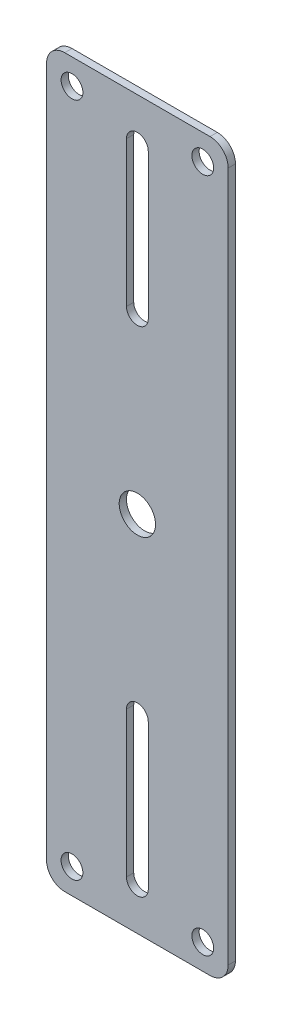
ISO-10303-21;
HEADER;
FILE_DESCRIPTION(('STEP AP214'),'2;1');
FILE_NAME('part.step','',(''),(''),'','','');
FILE_SCHEMA(('AUTOMOTIVE_DESIGN { 1 0 10303 214 1 1 1 1 }'));
ENDSEC;
DATA;
#1=APPLICATION_CONTEXT('core data for automotive mechanical design processes');
#2=APPLICATION_PROTOCOL_DEFINITION('international standard','automotive_design',2000,#1);
#3=PRODUCT_CONTEXT('',#1,'mechanical');
#4=PRODUCT('Part','Part','',(#3));
#5=PRODUCT_RELATED_PRODUCT_CATEGORY('part','',(#4));
#6=PRODUCT_DEFINITION_FORMATION('','',#4);
#7=PRODUCT_DEFINITION_CONTEXT('part definition',#1,'design');
#8=PRODUCT_DEFINITION('design','',#6,#7);
#9=PRODUCT_DEFINITION_SHAPE('','',#8);
#10=(LENGTH_UNIT() NAMED_UNIT(*) SI_UNIT(.MILLI.,.METRE.));
#11=(NAMED_UNIT(*) PLANE_ANGLE_UNIT() SI_UNIT($,.RADIAN.));
#12=(NAMED_UNIT(*) SI_UNIT($,.STERADIAN.) SOLID_ANGLE_UNIT());
#13=UNCERTAINTY_MEASURE_WITH_UNIT(LENGTH_MEASURE(1.E-05),#10,'distance_accuracy_value','');
#14=(GEOMETRIC_REPRESENTATION_CONTEXT(3) GLOBAL_UNCERTAINTY_ASSIGNED_CONTEXT((#13)) GLOBAL_UNIT_ASSIGNED_CONTEXT((#10,
#11,#12)) REPRESENTATION_CONTEXT('',''));
#15=CARTESIAN_POINT('',(0.,0.,0.));
#16=DIRECTION('',(0.,0.,1.));
#17=DIRECTION('',(1.,0.,0.));
#18=AXIS2_PLACEMENT_3D('',#15,#16,#17);
#19=CARTESIAN_POINT('',(0.,0.,2.));
#20=DIRECTION('',(0.,0.,1.));
#21=DIRECTION('',(1.,0.,0.));
#22=AXIS2_PLACEMENT_3D('',#19,#20,#21);
#23=PLANE('',#22);
#24=CARTESIAN_POINT('',(0.,0.,2.));
#25=DIRECTION('',(0.,0.,1.));
#26=DIRECTION('',(1.,0.,0.));
#27=AXIS2_PLACEMENT_3D('',#24,#25,#26);
#28=CIRCLE('',#27,5.);
#29=CARTESIAN_POINT('',(5.,0.,2.));
#30=VERTEX_POINT('',#29);
#31=EDGE_CURVE('E382',#30,#30,#28,.T.);
#32=ORIENTED_EDGE('',*,*,#31,.F.);
#33=EDGE_LOOP('',(#32));
#34=FACE_BOUND('',#33,.T.);
#35=CARTESIAN_POINT('',(-18.,93.,2.));
#36=DIRECTION('',(0.,0.,1.));
#37=DIRECTION('',(1.,0.,0.));
#38=AXIS2_PLACEMENT_3D('',#35,#36,#37);
#39=CIRCLE('',#38,3.);
#40=CARTESIAN_POINT('',(-15.,93.,2.));
#41=VERTEX_POINT('',#40);
#42=EDGE_CURVE('E227',#41,#41,#39,.T.);
#43=ORIENTED_EDGE('',*,*,#42,.F.);
#44=EDGE_LOOP('',(#43));
#45=FACE_BOUND('',#44,.T.);
#46=DIRECTION('',(-1.,0.,0.));
#47=VECTOR('',#46,1.);
#48=CARTESIAN_POINT('',(-25.,100.,2.));
#49=LINE('',#48,#47);
#50=CARTESIAN_POINT('',(20.,100.,2.));
#51=VERTEX_POINT('',#50);
#52=CARTESIAN_POINT('',(-20.,100.,2.));
#53=VERTEX_POINT('',#52);
#54=EDGE_CURVE('E267',#51,#53,#49,.T.);
#55=ORIENTED_EDGE('',*,*,#54,.T.);
#56=CARTESIAN_POINT('',(-20.,95.,2.));
#57=DIRECTION('',(0.,0.,1.));
#58=DIRECTION('',(1.,0.,0.));
#59=AXIS2_PLACEMENT_3D('',#56,#57,#58);
#60=CIRCLE('',#59,5.);
#61=CARTESIAN_POINT('',(-25.,95.,2.));
#62=VERTEX_POINT('',#61);
#63=EDGE_CURVE('E11',#53,#62,#60,.T.);
#64=ORIENTED_EDGE('',*,*,#63,.T.);
#65=DIRECTION('',(0.,-1.,0.));
#66=VECTOR('',#65,1.);
#67=CARTESIAN_POINT('',(-25.,100.,2.));
#68=LINE('',#67,#66);
#69=CARTESIAN_POINT('',(-25.,-95.,2.));
#70=VERTEX_POINT('',#69);
#71=EDGE_CURVE('E270',#62,#70,#68,.T.);
#72=ORIENTED_EDGE('',*,*,#71,.T.);
#73=CARTESIAN_POINT('',(-20.,-95.,2.));
#74=DIRECTION('',(0.,0.,-1.));
#75=DIRECTION('',(1.,0.,0.));
#76=AXIS2_PLACEMENT_3D('',#73,#74,#75);
#77=CIRCLE('',#76,5.);
#78=CARTESIAN_POINT('',(-20.,-100.,2.));
#79=VERTEX_POINT('',#78);
#80=EDGE_CURVE('E217',#79,#70,#77,.T.);
#81=ORIENTED_EDGE('',*,*,#80,.F.);
#82=DIRECTION('',(-1.,0.,0.));
#83=VECTOR('',#82,1.);
#84=CARTESIAN_POINT('',(-25.,-100.,2.));
#85=LINE('',#84,#83);
#86=CARTESIAN_POINT('',(20.,-100.,2.));
#87=VERTEX_POINT('',#86);
#88=EDGE_CURVE('E193',#87,#79,#85,.T.);
#89=ORIENTED_EDGE('',*,*,#88,.F.);
#90=CARTESIAN_POINT('',(20.,-95.,2.));
#91=DIRECTION('',(0.,0.,-1.));
#92=DIRECTION('',(1.,0.,0.));
#93=AXIS2_PLACEMENT_3D('',#90,#91,#92);
#94=CIRCLE('',#93,5.);
#95=CARTESIAN_POINT('',(25.,-95.,2.));
#96=VERTEX_POINT('',#95);
#97=EDGE_CURVE('E206',#96,#87,#94,.T.);
#98=ORIENTED_EDGE('',*,*,#97,.F.);
#99=DIRECTION('',(0.,1.,0.));
#100=VECTOR('',#99,1.);
#101=CARTESIAN_POINT('',(25.,100.,2.));
#102=LINE('',#101,#100);
#103=CARTESIAN_POINT('',(25.,95.,2.));
#104=VERTEX_POINT('',#103);
#105=EDGE_CURVE('E264',#96,#104,#102,.T.);
#106=ORIENTED_EDGE('',*,*,#105,.T.);
#107=CARTESIAN_POINT('',(20.,95.,2.));
#108=DIRECTION('',(0.,0.,1.));
#109=DIRECTION('',(1.,0.,0.));
#110=AXIS2_PLACEMENT_3D('',#107,#108,#109);
#111=CIRCLE('',#110,5.);
#112=EDGE_CURVE('E284',#104,#51,#111,.T.);
#113=ORIENTED_EDGE('',*,*,#112,.T.);
#114=EDGE_LOOP('',(#55,#64,#72,#81,#89,#98,#106,#113));
#115=FACE_BOUND('',#114,.T.);
#116=DIRECTION('',(0.,-1.,0.));
#117=VECTOR('',#116,1.);
#118=CARTESIAN_POINT('',(-2.99999999999999,88.,2.));
#119=LINE('',#118,#117);
#120=CARTESIAN_POINT('',(-2.99999999999999,88.,2.));
#121=VERTEX_POINT('',#120);
#122=CARTESIAN_POINT('',(-3.,48.,2.));
#123=VERTEX_POINT('',#122);
#124=EDGE_CURVE('E235',#121,#123,#119,.T.);
#125=ORIENTED_EDGE('',*,*,#124,.F.);
#126=CARTESIAN_POINT('',(0.,88.,2.));
#127=DIRECTION('',(0.,0.,1.));
#128=DIRECTION('',(1.,0.,0.));
#129=AXIS2_PLACEMENT_3D('',#126,#127,#128);
#130=CIRCLE('',#129,3.);
#131=CARTESIAN_POINT('',(3.,88.,2.));
#132=VERTEX_POINT('',#131);
#133=EDGE_CURVE('E233',#132,#121,#130,.T.);
#134=ORIENTED_EDGE('',*,*,#133,.F.);
#135=DIRECTION('',(0.,1.,0.));
#136=VECTOR('',#135,1.);
#137=CARTESIAN_POINT('',(3.,48.,2.));
#138=LINE('',#137,#136);
#139=CARTESIAN_POINT('',(3.,48.,2.));
#140=VERTEX_POINT('',#139);
#141=EDGE_CURVE('E241',#140,#132,#138,.T.);
#142=ORIENTED_EDGE('',*,*,#141,.F.);
#143=CARTESIAN_POINT('',(0.,48.,2.));
#144=DIRECTION('',(0.,0.,1.));
#145=DIRECTION('',(1.,0.,0.));
#146=AXIS2_PLACEMENT_3D('',#143,#144,#145);
#147=CIRCLE('',#146,3.);
#148=EDGE_CURVE('E238',#123,#140,#147,.T.);
#149=ORIENTED_EDGE('',*,*,#148,.F.);
#150=EDGE_LOOP('',(#125,#134,#142,#149));
#151=FACE_BOUND('',#150,.T.);
#152=CARTESIAN_POINT('',(18.,93.,2.));
#153=DIRECTION('',(0.,0.,1.));
#154=DIRECTION('',(1.,0.,0.));
#155=AXIS2_PLACEMENT_3D('',#152,#153,#154);
#156=CIRCLE('',#155,3.);
#157=CARTESIAN_POINT('',(21.,93.,2.));
#158=VERTEX_POINT('',#157);
#159=EDGE_CURVE('E221',#158,#158,#156,.T.);
#160=ORIENTED_EDGE('',*,*,#159,.F.);
#161=EDGE_LOOP('',(#160));
#162=FACE_BOUND('',#161,.T.);
#163=CARTESIAN_POINT('',(-18.,-93.,2.));
#164=DIRECTION('',(0.,0.,-1.));
#165=DIRECTION('',(1.,0.,0.));
#166=AXIS2_PLACEMENT_3D('',#163,#164,#165);
#167=CIRCLE('',#166,3.);
#168=CARTESIAN_POINT('',(-15.,-93.,2.));
#169=VERTEX_POINT('',#168);
#170=EDGE_CURVE('E182',#169,#169,#167,.T.);
#171=ORIENTED_EDGE('',*,*,#170,.T.);
#172=EDGE_LOOP('',(#171));
#173=FACE_BOUND('',#172,.T.);
#174=DIRECTION('',(0.,1.,0.));
#175=VECTOR('',#174,1.);
#176=CARTESIAN_POINT('',(-2.99999999999999,-88.,2.));
#177=LINE('',#176,#175);
#178=CARTESIAN_POINT('',(-2.99999999999999,-88.,2.));
#179=VERTEX_POINT('',#178);
#180=CARTESIAN_POINT('',(-3.,-48.,2.));
#181=VERTEX_POINT('',#180);
#182=EDGE_CURVE('E166',#179,#181,#177,.T.);
#183=ORIENTED_EDGE('',*,*,#182,.T.);
#184=CARTESIAN_POINT('',(0.,-48.,2.));
#185=DIRECTION('',(0.,0.,-1.));
#186=DIRECTION('',(1.,0.,0.));
#187=AXIS2_PLACEMENT_3D('',#184,#185,#186);
#188=CIRCLE('',#187,3.);
#189=CARTESIAN_POINT('',(3.,-48.,2.));
#190=VERTEX_POINT('',#189);
#191=EDGE_CURVE('E173',#181,#190,#188,.T.);
#192=ORIENTED_EDGE('',*,*,#191,.T.);
#193=DIRECTION('',(0.,-1.,0.));
#194=VECTOR('',#193,1.);
#195=CARTESIAN_POINT('',(3.,-48.,2.));
#196=LINE('',#195,#194);
#197=CARTESIAN_POINT('',(3.,-88.,2.));
#198=VERTEX_POINT('',#197);
#199=EDGE_CURVE('E168',#190,#198,#196,.T.);
#200=ORIENTED_EDGE('',*,*,#199,.T.);
#201=CARTESIAN_POINT('',(0.,-88.,2.));
#202=DIRECTION('',(0.,0.,-1.));
#203=DIRECTION('',(1.,0.,0.));
#204=AXIS2_PLACEMENT_3D('',#201,#202,#203);
#205=CIRCLE('',#204,3.);
#206=EDGE_CURVE('E151',#198,#179,#205,.T.);
#207=ORIENTED_EDGE('',*,*,#206,.T.);
#208=EDGE_LOOP('',(#183,#192,#200,#207));
#209=FACE_BOUND('',#208,.T.);
#210=CARTESIAN_POINT('',(18.,-93.,2.));
#211=DIRECTION('',(0.,0.,-1.));
#212=DIRECTION('',(1.,0.,0.));
#213=AXIS2_PLACEMENT_3D('',#210,#211,#212);
#214=CIRCLE('',#213,3.);
#215=CARTESIAN_POINT('',(21.,-93.,2.));
#216=VERTEX_POINT('',#215);
#217=EDGE_CURVE('E374',#216,#216,#214,.T.);
#218=ORIENTED_EDGE('',*,*,#217,.T.);
#219=EDGE_LOOP('',(#218));
#220=FACE_BOUND('',#219,.T.);
#221=ADVANCED_FACE('F35',(#34,#45,#115,#151,#162,#173,#209,#220),#23,.T.);
#222=CARTESIAN_POINT('',(0.,0.,0.));
#223=DIRECTION('',(0.,0.,1.));
#224=DIRECTION('',(1.,0.,0.));
#225=AXIS2_PLACEMENT_3D('',#222,#223,#224);
#226=PLANE('',#225);
#227=CARTESIAN_POINT('',(0.,0.,0.));
#228=DIRECTION('',(0.,0.,1.));
#229=DIRECTION('',(1.,0.,0.));
#230=AXIS2_PLACEMENT_3D('',#227,#228,#229);
#231=CIRCLE('',#230,5.);
#232=CARTESIAN_POINT('',(5.,0.,0.));
#233=VERTEX_POINT('',#232);
#234=EDGE_CURVE('E379',#233,#233,#231,.T.);
#235=ORIENTED_EDGE('',*,*,#234,.T.);
#236=EDGE_LOOP('',(#235));
#237=FACE_BOUND('',#236,.T.);
#238=CARTESIAN_POINT('',(-18.,93.,0.));
#239=DIRECTION('',(0.,0.,1.));
#240=DIRECTION('',(1.,0.,0.));
#241=AXIS2_PLACEMENT_3D('',#238,#239,#240);
#242=CIRCLE('',#241,3.);
#243=CARTESIAN_POINT('',(-15.,93.,0.));
#244=VERTEX_POINT('',#243);
#245=EDGE_CURVE('E224',#244,#244,#242,.T.);
#246=ORIENTED_EDGE('',*,*,#245,.T.);
#247=EDGE_LOOP('',(#246));
#248=FACE_BOUND('',#247,.T.);
#249=DIRECTION('',(0.,-1.,0.));
#250=VECTOR('',#249,1.);
#251=CARTESIAN_POINT('',(-25.,100.,0.));
#252=LINE('',#251,#250);
#253=CARTESIAN_POINT('',(-25.,95.,0.));
#254=VERTEX_POINT('',#253);
#255=CARTESIAN_POINT('',(-25.,-95.,0.));
#256=VERTEX_POINT('',#255);
#257=EDGE_CURVE('E268',#254,#256,#252,.T.);
#258=ORIENTED_EDGE('',*,*,#257,.F.);
#259=CARTESIAN_POINT('',(-20.,95.,0.));
#260=DIRECTION('',(0.,0.,1.));
#261=DIRECTION('',(1.,0.,0.));
#262=AXIS2_PLACEMENT_3D('',#259,#260,#261);
#263=CIRCLE('',#262,5.);
#264=CARTESIAN_POINT('',(-20.,100.,0.));
#265=VERTEX_POINT('',#264);
#266=EDGE_CURVE('E57',#254,#265,#263,.F.);
#267=ORIENTED_EDGE('',*,*,#266,.T.);
#268=DIRECTION('',(-1.,0.,0.));
#269=VECTOR('',#268,1.);
#270=CARTESIAN_POINT('',(-25.,100.,0.));
#271=LINE('',#270,#269);
#272=CARTESIAN_POINT('',(20.,100.,0.));
#273=VERTEX_POINT('',#272);
#274=EDGE_CURVE('E275',#273,#265,#271,.T.);
#275=ORIENTED_EDGE('',*,*,#274,.F.);
#276=CARTESIAN_POINT('',(20.,95.,0.));
#277=DIRECTION('',(0.,0.,1.));
#278=DIRECTION('',(1.,0.,0.));
#279=AXIS2_PLACEMENT_3D('',#276,#277,#278);
#280=CIRCLE('',#279,5.);
#281=CARTESIAN_POINT('',(25.,95.,0.));
#282=VERTEX_POINT('',#281);
#283=EDGE_CURVE('E280',#273,#282,#280,.F.);
#284=ORIENTED_EDGE('',*,*,#283,.T.);
#285=DIRECTION('',(0.,1.,0.));
#286=VECTOR('',#285,1.);
#287=CARTESIAN_POINT('',(25.,100.,0.));
#288=LINE('',#287,#286);
#289=CARTESIAN_POINT('',(25.,-95.,0.));
#290=VERTEX_POINT('',#289);
#291=EDGE_CURVE('E263',#290,#282,#288,.T.);
#292=ORIENTED_EDGE('',*,*,#291,.F.);
#293=CARTESIAN_POINT('',(20.,-95.,0.));
#294=DIRECTION('',(0.,0.,-1.));
#295=DIRECTION('',(1.,0.,0.));
#296=AXIS2_PLACEMENT_3D('',#293,#294,#295);
#297=CIRCLE('',#296,5.);
#298=CARTESIAN_POINT('',(20.,-100.,0.));
#299=VERTEX_POINT('',#298);
#300=EDGE_CURVE('E200',#299,#290,#297,.F.);
#301=ORIENTED_EDGE('',*,*,#300,.F.);
#302=DIRECTION('',(-1.,0.,0.));
#303=VECTOR('',#302,1.);
#304=CARTESIAN_POINT('',(-25.,-100.,0.));
#305=LINE('',#304,#303);
#306=CARTESIAN_POINT('',(-20.,-100.,0.));
#307=VERTEX_POINT('',#306);
#308=EDGE_CURVE('E159',#299,#307,#305,.T.);
#309=ORIENTED_EDGE('',*,*,#308,.T.);
#310=CARTESIAN_POINT('',(-20.,-95.,0.));
#311=DIRECTION('',(0.,0.,-1.));
#312=DIRECTION('',(1.,0.,0.));
#313=AXIS2_PLACEMENT_3D('',#310,#311,#312);
#314=CIRCLE('',#313,5.);
#315=EDGE_CURVE('E212',#256,#307,#314,.F.);
#316=ORIENTED_EDGE('',*,*,#315,.F.);
#317=EDGE_LOOP('',(#258,#267,#275,#284,#292,#301,#309,#316));
#318=FACE_BOUND('',#317,.T.);
#319=CARTESIAN_POINT('',(0.,88.,0.));
#320=DIRECTION('',(0.,0.,1.));
#321=DIRECTION('',(1.,0.,0.));
#322=AXIS2_PLACEMENT_3D('',#319,#320,#321);
#323=CIRCLE('',#322,3.);
#324=CARTESIAN_POINT('',(3.,88.,0.));
#325=VERTEX_POINT('',#324);
#326=CARTESIAN_POINT('',(-2.99999999999999,88.,0.));
#327=VERTEX_POINT('',#326);
#328=EDGE_CURVE('E230',#325,#327,#323,.T.);
#329=ORIENTED_EDGE('',*,*,#328,.T.);
#330=DIRECTION('',(0.,-1.,0.));
#331=VECTOR('',#330,1.);
#332=CARTESIAN_POINT('',(-2.99999999999999,88.,0.));
#333=LINE('',#332,#331);
#334=CARTESIAN_POINT('',(-3.,48.,0.));
#335=VERTEX_POINT('',#334);
#336=EDGE_CURVE('E246',#327,#335,#333,.T.);
#337=ORIENTED_EDGE('',*,*,#336,.T.);
#338=CARTESIAN_POINT('',(0.,48.,0.));
#339=DIRECTION('',(0.,0.,1.));
#340=DIRECTION('',(1.,0.,0.));
#341=AXIS2_PLACEMENT_3D('',#338,#339,#340);
#342=CIRCLE('',#341,3.);
#343=CARTESIAN_POINT('',(3.,48.,0.));
#344=VERTEX_POINT('',#343);
#345=EDGE_CURVE('E249',#335,#344,#342,.T.);
#346=ORIENTED_EDGE('',*,*,#345,.T.);
#347=DIRECTION('',(0.,1.,0.));
#348=VECTOR('',#347,1.);
#349=CARTESIAN_POINT('',(3.,48.,0.));
#350=LINE('',#349,#348);
#351=EDGE_CURVE('E236',#344,#325,#350,.T.);
#352=ORIENTED_EDGE('',*,*,#351,.T.);
#353=EDGE_LOOP('',(#329,#337,#346,#352));
#354=FACE_BOUND('',#353,.T.);
#355=CARTESIAN_POINT('',(18.,93.,0.));
#356=DIRECTION('',(0.,0.,1.));
#357=DIRECTION('',(1.,0.,0.));
#358=AXIS2_PLACEMENT_3D('',#355,#356,#357);
#359=CIRCLE('',#358,3.);
#360=CARTESIAN_POINT('',(21.,93.,0.));
#361=VERTEX_POINT('',#360);
#362=EDGE_CURVE('E220',#361,#361,#359,.T.);
#363=ORIENTED_EDGE('',*,*,#362,.T.);
#364=EDGE_LOOP('',(#363));
#365=FACE_BOUND('',#364,.T.);
#366=CARTESIAN_POINT('',(-18.,-93.,0.));
#367=DIRECTION('',(0.,0.,-1.));
#368=DIRECTION('',(1.,0.,0.));
#369=AXIS2_PLACEMENT_3D('',#366,#367,#368);
#370=CIRCLE('',#369,3.);
#371=CARTESIAN_POINT('',(-15.,-93.,0.));
#372=VERTEX_POINT('',#371);
#373=EDGE_CURVE('E371',#372,#372,#370,.T.);
#374=ORIENTED_EDGE('',*,*,#373,.F.);
#375=EDGE_LOOP('',(#374));
#376=FACE_BOUND('',#375,.T.);
#377=CARTESIAN_POINT('',(0.,-88.,0.));
#378=DIRECTION('',(0.,0.,-1.));
#379=DIRECTION('',(1.,0.,0.));
#380=AXIS2_PLACEMENT_3D('',#377,#378,#379);
#381=CIRCLE('',#380,3.);
#382=CARTESIAN_POINT('',(3.,-88.,0.));
#383=VERTEX_POINT('',#382);
#384=CARTESIAN_POINT('',(-2.99999999999999,-88.,0.));
#385=VERTEX_POINT('',#384);
#386=EDGE_CURVE('E154',#383,#385,#381,.T.);
#387=ORIENTED_EDGE('',*,*,#386,.F.);
#388=DIRECTION('',(0.,-1.,0.));
#389=VECTOR('',#388,1.);
#390=CARTESIAN_POINT('',(3.,-48.,0.));
#391=LINE('',#390,#389);
#392=CARTESIAN_POINT('',(3.,-48.,0.));
#393=VERTEX_POINT('',#392);
#394=EDGE_CURVE('E169',#393,#383,#391,.T.);
#395=ORIENTED_EDGE('',*,*,#394,.F.);
#396=CARTESIAN_POINT('',(0.,-48.,0.));
#397=DIRECTION('',(0.,0.,-1.));
#398=DIRECTION('',(1.,0.,0.));
#399=AXIS2_PLACEMENT_3D('',#396,#397,#398);
#400=CIRCLE('',#399,3.);
#401=CARTESIAN_POINT('',(-3.,-48.,0.));
#402=VERTEX_POINT('',#401);
#403=EDGE_CURVE('E184',#402,#393,#400,.T.);
#404=ORIENTED_EDGE('',*,*,#403,.F.);
#405=DIRECTION('',(0.,1.,0.));
#406=VECTOR('',#405,1.);
#407=CARTESIAN_POINT('',(-2.99999999999999,-88.,0.));
#408=LINE('',#407,#406);
#409=EDGE_CURVE('E181',#385,#402,#408,.T.);
#410=ORIENTED_EDGE('',*,*,#409,.F.);
#411=EDGE_LOOP('',(#387,#395,#404,#410));
#412=FACE_BOUND('',#411,.T.);
#413=CARTESIAN_POINT('',(18.,-93.,0.));
#414=DIRECTION('',(0.,0.,-1.));
#415=DIRECTION('',(1.,0.,0.));
#416=AXIS2_PLACEMENT_3D('',#413,#414,#415);
#417=CIRCLE('',#416,3.);
#418=CARTESIAN_POINT('',(21.,-93.,0.));
#419=VERTEX_POINT('',#418);
#420=EDGE_CURVE('E376',#419,#419,#417,.T.);
#421=ORIENTED_EDGE('',*,*,#420,.F.);
#422=EDGE_LOOP('',(#421));
#423=FACE_BOUND('',#422,.T.);
#424=ADVANCED_FACE('F297',(#237,#248,#318,#354,#365,#376,#412,#423),#226,.F.);
#425=CARTESIAN_POINT('',(25.,100.,2.));
#426=DIRECTION('',(-1.,0.,0.));
#427=DIRECTION('',(0.,-1.,0.));
#428=AXIS2_PLACEMENT_3D('',#425,#426,#427);
#429=PLANE('',#428);
#430=ORIENTED_EDGE('',*,*,#291,.T.);
#431=DIRECTION('',(0.,0.,-1.));
#432=VECTOR('',#431,1.);
#433=CARTESIAN_POINT('',(25.,95.,2.));
#434=LINE('',#433,#432);
#435=EDGE_CURVE('E282',#282,#104,#434,.F.);
#436=ORIENTED_EDGE('',*,*,#435,.T.);
#437=ORIENTED_EDGE('',*,*,#105,.F.);
#438=DIRECTION('',(0.,0.,-1.));
#439=VECTOR('',#438,1.);
#440=CARTESIAN_POINT('',(25.,-95.,2.));
#441=LINE('',#440,#439);
#442=EDGE_CURVE('E203',#290,#96,#441,.F.);
#443=ORIENTED_EDGE('',*,*,#442,.F.);
#444=EDGE_LOOP('',(#430,#436,#437,#443));
#445=FACE_BOUND('',#444,.T.);
#446=ADVANCED_FACE('F320',(#445),#429,.F.);
#447=CARTESIAN_POINT('',(-25.,100.,2.));
#448=DIRECTION('',(0.,-1.,0.));
#449=DIRECTION('',(0.,0.,-1.));
#450=AXIS2_PLACEMENT_3D('',#447,#448,#449);
#451=PLANE('',#450);
#452=ORIENTED_EDGE('',*,*,#274,.T.);
#453=DIRECTION('',(0.,0.,-1.));
#454=VECTOR('',#453,1.);
#455=CARTESIAN_POINT('',(-20.,100.,2.));
#456=LINE('',#455,#454);
#457=EDGE_CURVE('E43',#265,#53,#456,.F.);
#458=ORIENTED_EDGE('',*,*,#457,.T.);
#459=ORIENTED_EDGE('',*,*,#54,.F.);
#460=DIRECTION('',(0.,0.,-1.));
#461=VECTOR('',#460,1.);
#462=CARTESIAN_POINT('',(20.,100.,2.));
#463=LINE('',#462,#461);
#464=EDGE_CURVE('E272',#51,#273,#463,.T.);
#465=ORIENTED_EDGE('',*,*,#464,.T.);
#466=EDGE_LOOP('',(#452,#458,#459,#465));
#467=FACE_BOUND('',#466,.T.);
#468=ADVANCED_FACE('F319',(#467),#451,.F.);
#469=CARTESIAN_POINT('',(-25.,100.,2.));
#470=DIRECTION('',(1.,0.,0.));
#471=DIRECTION('',(0.,1.,0.));
#472=AXIS2_PLACEMENT_3D('',#469,#470,#471);
#473=PLANE('',#472);
#474=ORIENTED_EDGE('',*,*,#71,.F.);
#475=DIRECTION('',(0.,0.,-1.));
#476=VECTOR('',#475,1.);
#477=CARTESIAN_POINT('',(-25.,95.,2.));
#478=LINE('',#477,#476);
#479=EDGE_CURVE('E286',#62,#254,#478,.T.);
#480=ORIENTED_EDGE('',*,*,#479,.T.);
#481=ORIENTED_EDGE('',*,*,#257,.T.);
#482=DIRECTION('',(0.,0.,-1.));
#483=VECTOR('',#482,1.);
#484=CARTESIAN_POINT('',(-25.,-95.,2.));
#485=LINE('',#484,#483);
#486=EDGE_CURVE('E209',#70,#256,#485,.T.);
#487=ORIENTED_EDGE('',*,*,#486,.F.);
#488=EDGE_LOOP('',(#474,#480,#481,#487));
#489=FACE_BOUND('',#488,.T.);
#490=ADVANCED_FACE('F292',(#489),#473,.F.);
#491=CARTESIAN_POINT('',(0.,88.,2.));
#492=DIRECTION('',(0.,0.,-1.));
#493=DIRECTION('',(-1.,0.,0.));
#494=AXIS2_PLACEMENT_3D('',#491,#492,#493);
#495=CYLINDRICAL_SURFACE('',#494,3.);
#496=ORIENTED_EDGE('',*,*,#328,.F.);
#497=DIRECTION('',(0.,0.,-1.));
#498=VECTOR('',#497,1.);
#499=CARTESIAN_POINT('',(3.,88.,2.));
#500=LINE('',#499,#498);
#501=EDGE_CURVE('E243',#132,#325,#500,.T.);
#502=ORIENTED_EDGE('',*,*,#501,.F.);
#503=ORIENTED_EDGE('',*,*,#133,.T.);
#504=DIRECTION('',(0.,0.,-1.));
#505=VECTOR('',#504,1.);
#506=CARTESIAN_POINT('',(-2.99999999999999,88.,2.));
#507=LINE('',#506,#505);
#508=EDGE_CURVE('E260',#121,#327,#507,.T.);
#509=ORIENTED_EDGE('',*,*,#508,.T.);
#510=EDGE_LOOP('',(#496,#502,#503,#509));
#511=FACE_BOUND('',#510,.T.);
#512=ADVANCED_FACE('F338',(#511),#495,.F.);
#513=CARTESIAN_POINT('',(-2.99999999999999,88.,2.));
#514=DIRECTION('',(1.,0.,0.));
#515=DIRECTION('',(0.,1.,0.));
#516=AXIS2_PLACEMENT_3D('',#513,#514,#515);
#517=PLANE('',#516);
#518=ORIENTED_EDGE('',*,*,#336,.F.);
#519=ORIENTED_EDGE('',*,*,#508,.F.);
#520=ORIENTED_EDGE('',*,*,#124,.T.);
#521=DIRECTION('',(0.,0.,-1.));
#522=VECTOR('',#521,1.);
#523=CARTESIAN_POINT('',(-3.,48.,2.));
#524=LINE('',#523,#522);
#525=EDGE_CURVE('E258',#123,#335,#524,.T.);
#526=ORIENTED_EDGE('',*,*,#525,.T.);
#527=EDGE_LOOP('',(#518,#519,#520,#526));
#528=FACE_BOUND('',#527,.T.);
#529=ADVANCED_FACE('F345',(#528),#517,.T.);
#530=CARTESIAN_POINT('',(0.,48.,2.));
#531=DIRECTION('',(0.,0.,-1.));
#532=DIRECTION('',(-1.,0.,0.));
#533=AXIS2_PLACEMENT_3D('',#530,#531,#532);
#534=CYLINDRICAL_SURFACE('',#533,3.);
#535=ORIENTED_EDGE('',*,*,#345,.F.);
#536=ORIENTED_EDGE('',*,*,#525,.F.);
#537=ORIENTED_EDGE('',*,*,#148,.T.);
#538=DIRECTION('',(0.,0.,-1.));
#539=VECTOR('',#538,1.);
#540=CARTESIAN_POINT('',(3.,48.,2.));
#541=LINE('',#540,#539);
#542=EDGE_CURVE('E256',#140,#344,#541,.T.);
#543=ORIENTED_EDGE('',*,*,#542,.T.);
#544=EDGE_LOOP('',(#535,#536,#537,#543));
#545=FACE_BOUND('',#544,.T.);
#546=ADVANCED_FACE('F350',(#545),#534,.F.);
#547=CARTESIAN_POINT('',(3.,48.,2.));
#548=DIRECTION('',(-1.,0.,0.));
#549=DIRECTION('',(0.,-1.,0.));
#550=AXIS2_PLACEMENT_3D('',#547,#548,#549);
#551=PLANE('',#550);
#552=ORIENTED_EDGE('',*,*,#351,.F.);
#553=ORIENTED_EDGE('',*,*,#542,.F.);
#554=ORIENTED_EDGE('',*,*,#141,.T.);
#555=ORIENTED_EDGE('',*,*,#501,.T.);
#556=EDGE_LOOP('',(#552,#553,#554,#555));
#557=FACE_BOUND('',#556,.T.);
#558=ADVANCED_FACE('F357',(#557),#551,.T.);
#559=CARTESIAN_POINT('',(-18.,93.,2.));
#560=DIRECTION('',(0.,0.,-1.));
#561=DIRECTION('',(-1.,0.,0.));
#562=AXIS2_PLACEMENT_3D('',#559,#560,#561);
#563=CYLINDRICAL_SURFACE('',#562,3.);
#564=ORIENTED_EDGE('',*,*,#42,.T.);
#565=EDGE_LOOP('',(#564));
#566=FACE_BOUND('',#565,.T.);
#567=ORIENTED_EDGE('',*,*,#245,.F.);
#568=EDGE_LOOP('',(#567));
#569=FACE_BOUND('',#568,.T.);
#570=ADVANCED_FACE('F424',(#566,#569),#563,.F.);
#571=CARTESIAN_POINT('',(18.,93.,2.));
#572=DIRECTION('',(0.,0.,-1.));
#573=DIRECTION('',(-1.,0.,0.));
#574=AXIS2_PLACEMENT_3D('',#571,#572,#573);
#575=CYLINDRICAL_SURFACE('',#574,3.);
#576=ORIENTED_EDGE('',*,*,#159,.T.);
#577=EDGE_LOOP('',(#576));
#578=FACE_BOUND('',#577,.T.);
#579=ORIENTED_EDGE('',*,*,#362,.F.);
#580=EDGE_LOOP('',(#579));
#581=FACE_BOUND('',#580,.T.);
#582=ADVANCED_FACE('F421',(#578,#581),#575,.F.);
#583=CARTESIAN_POINT('',(20.,95.,2.));
#584=DIRECTION('',(0.,0.,-1.));
#585=DIRECTION('',(-1.,0.,0.));
#586=AXIS2_PLACEMENT_3D('',#583,#584,#585);
#587=CYLINDRICAL_SURFACE('',#586,5.);
#588=ORIENTED_EDGE('',*,*,#112,.F.);
#589=ORIENTED_EDGE('',*,*,#435,.F.);
#590=ORIENTED_EDGE('',*,*,#283,.F.);
#591=ORIENTED_EDGE('',*,*,#464,.F.);
#592=EDGE_LOOP('',(#588,#589,#590,#591));
#593=FACE_BOUND('',#592,.T.);
#594=ADVANCED_FACE('F318',(#593),#587,.T.);
#595=CARTESIAN_POINT('',(-20.,95.,2.));
#596=DIRECTION('',(0.,0.,-1.));
#597=DIRECTION('',(-1.,0.,0.));
#598=AXIS2_PLACEMENT_3D('',#595,#596,#597);
#599=CYLINDRICAL_SURFACE('',#598,5.);
#600=ORIENTED_EDGE('',*,*,#63,.F.);
#601=ORIENTED_EDGE('',*,*,#457,.F.);
#602=ORIENTED_EDGE('',*,*,#266,.F.);
#603=ORIENTED_EDGE('',*,*,#479,.F.);
#604=EDGE_LOOP('',(#600,#601,#602,#603));
#605=FACE_BOUND('',#604,.T.);
#606=ADVANCED_FACE('F37',(#605),#599,.T.);
#607=CARTESIAN_POINT('',(-25.,-100.,2.));
#608=DIRECTION('',(0.,1.,0.));
#609=DIRECTION('',(0.,0.,-1.));
#610=AXIS2_PLACEMENT_3D('',#607,#608,#609);
#611=PLANE('',#610);
#612=ORIENTED_EDGE('',*,*,#308,.F.);
#613=DIRECTION('',(0.,0.,-1.));
#614=VECTOR('',#613,1.);
#615=CARTESIAN_POINT('',(20.,-100.,2.));
#616=LINE('',#615,#614);
#617=EDGE_CURVE('E196',#87,#299,#616,.T.);
#618=ORIENTED_EDGE('',*,*,#617,.F.);
#619=ORIENTED_EDGE('',*,*,#88,.T.);
#620=DIRECTION('',(0.,0.,-1.));
#621=VECTOR('',#620,1.);
#622=CARTESIAN_POINT('',(-20.,-100.,2.));
#623=LINE('',#622,#621);
#624=EDGE_CURVE('E215',#307,#79,#623,.F.);
#625=ORIENTED_EDGE('',*,*,#624,.F.);
#626=EDGE_LOOP('',(#612,#618,#619,#625));
#627=FACE_BOUND('',#626,.T.);
#628=ADVANCED_FACE('F309',(#627),#611,.F.);
#629=CARTESIAN_POINT('',(0.,-88.,2.));
#630=DIRECTION('',(0.,0.,-1.));
#631=DIRECTION('',(-1.,0.,0.));
#632=AXIS2_PLACEMENT_3D('',#629,#630,#631);
#633=CYLINDRICAL_SURFACE('',#632,3.);
#634=ORIENTED_EDGE('',*,*,#386,.T.);
#635=DIRECTION('',(0.,0.,-1.));
#636=VECTOR('',#635,1.);
#637=CARTESIAN_POINT('',(-2.99999999999999,-88.,2.));
#638=LINE('',#637,#636);
#639=EDGE_CURVE('E148',#179,#385,#638,.T.);
#640=ORIENTED_EDGE('',*,*,#639,.F.);
#641=ORIENTED_EDGE('',*,*,#206,.F.);
#642=DIRECTION('',(0.,0.,-1.));
#643=VECTOR('',#642,1.);
#644=CARTESIAN_POINT('',(3.,-88.,2.));
#645=LINE('',#644,#643);
#646=EDGE_CURVE('E179',#198,#383,#645,.T.);
#647=ORIENTED_EDGE('',*,*,#646,.T.);
#648=EDGE_LOOP('',(#634,#640,#641,#647));
#649=FACE_BOUND('',#648,.T.);
#650=ADVANCED_FACE('F150',(#649),#633,.F.);
#651=CARTESIAN_POINT('',(-2.99999999999999,-88.,2.));
#652=DIRECTION('',(1.,0.,0.));
#653=DIRECTION('',(0.,-1.,0.));
#654=AXIS2_PLACEMENT_3D('',#651,#652,#653);
#655=PLANE('',#654);
#656=ORIENTED_EDGE('',*,*,#409,.T.);
#657=DIRECTION('',(0.,0.,-1.));
#658=VECTOR('',#657,1.);
#659=CARTESIAN_POINT('',(-3.,-48.,2.));
#660=LINE('',#659,#658);
#661=EDGE_CURVE('E160',#181,#402,#660,.T.);
#662=ORIENTED_EDGE('',*,*,#661,.F.);
#663=ORIENTED_EDGE('',*,*,#182,.F.);
#664=ORIENTED_EDGE('',*,*,#639,.T.);
#665=EDGE_LOOP('',(#656,#662,#663,#664));
#666=FACE_BOUND('',#665,.T.);
#667=ADVANCED_FACE('F171',(#666),#655,.T.);
#668=CARTESIAN_POINT('',(0.,-48.,2.));
#669=DIRECTION('',(0.,0.,-1.));
#670=DIRECTION('',(-1.,0.,0.));
#671=AXIS2_PLACEMENT_3D('',#668,#669,#670);
#672=CYLINDRICAL_SURFACE('',#671,3.);
#673=ORIENTED_EDGE('',*,*,#403,.T.);
#674=DIRECTION('',(0.,0.,-1.));
#675=VECTOR('',#674,1.);
#676=CARTESIAN_POINT('',(3.,-48.,2.));
#677=LINE('',#676,#675);
#678=EDGE_CURVE('E190',#190,#393,#677,.T.);
#679=ORIENTED_EDGE('',*,*,#678,.F.);
#680=ORIENTED_EDGE('',*,*,#191,.F.);
#681=ORIENTED_EDGE('',*,*,#661,.T.);
#682=EDGE_LOOP('',(#673,#679,#680,#681));
#683=FACE_BOUND('',#682,.T.);
#684=ADVANCED_FACE('F408',(#683),#672,.F.);
#685=CARTESIAN_POINT('',(3.,-48.,2.));
#686=DIRECTION('',(-1.,0.,0.));
#687=DIRECTION('',(0.,1.,0.));
#688=AXIS2_PLACEMENT_3D('',#685,#686,#687);
#689=PLANE('',#688);
#690=ORIENTED_EDGE('',*,*,#394,.T.);
#691=ORIENTED_EDGE('',*,*,#646,.F.);
#692=ORIENTED_EDGE('',*,*,#199,.F.);
#693=ORIENTED_EDGE('',*,*,#678,.T.);
#694=EDGE_LOOP('',(#690,#691,#692,#693));
#695=FACE_BOUND('',#694,.T.);
#696=ADVANCED_FACE('F405',(#695),#689,.T.);
#697=CARTESIAN_POINT('',(-18.,-93.,2.));
#698=DIRECTION('',(0.,0.,-1.));
#699=DIRECTION('',(-1.,0.,0.));
#700=AXIS2_PLACEMENT_3D('',#697,#698,#699);
#701=CYLINDRICAL_SURFACE('',#700,3.);
#702=ORIENTED_EDGE('',*,*,#170,.F.);
#703=EDGE_LOOP('',(#702));
#704=FACE_BOUND('',#703,.T.);
#705=ORIENTED_EDGE('',*,*,#373,.T.);
#706=EDGE_LOOP('',(#705));
#707=FACE_BOUND('',#706,.T.);
#708=ADVANCED_FACE('F401',(#704,#707),#701,.F.);
#709=CARTESIAN_POINT('',(18.,-93.,2.));
#710=DIRECTION('',(0.,0.,-1.));
#711=DIRECTION('',(-1.,0.,0.));
#712=AXIS2_PLACEMENT_3D('',#709,#710,#711);
#713=CYLINDRICAL_SURFACE('',#712,3.);
#714=ORIENTED_EDGE('',*,*,#217,.F.);
#715=EDGE_LOOP('',(#714));
#716=FACE_BOUND('',#715,.T.);
#717=ORIENTED_EDGE('',*,*,#420,.T.);
#718=EDGE_LOOP('',(#717));
#719=FACE_BOUND('',#718,.T.);
#720=ADVANCED_FACE('F398',(#716,#719),#713,.F.);
#721=CARTESIAN_POINT('',(20.,-95.,2.));
#722=DIRECTION('',(0.,0.,-1.));
#723=DIRECTION('',(-1.,0.,0.));
#724=AXIS2_PLACEMENT_3D('',#721,#722,#723);
#725=CYLINDRICAL_SURFACE('',#724,5.);
#726=ORIENTED_EDGE('',*,*,#97,.T.);
#727=ORIENTED_EDGE('',*,*,#617,.T.);
#728=ORIENTED_EDGE('',*,*,#300,.T.);
#729=ORIENTED_EDGE('',*,*,#442,.T.);
#730=EDGE_LOOP('',(#726,#727,#728,#729));
#731=FACE_BOUND('',#730,.T.);
#732=ADVANCED_FACE('F311',(#731),#725,.T.);
#733=CARTESIAN_POINT('',(-20.,-95.,2.));
#734=DIRECTION('',(0.,0.,-1.));
#735=DIRECTION('',(-1.,0.,0.));
#736=AXIS2_PLACEMENT_3D('',#733,#734,#735);
#737=CYLINDRICAL_SURFACE('',#736,5.);
#738=ORIENTED_EDGE('',*,*,#80,.T.);
#739=ORIENTED_EDGE('',*,*,#486,.T.);
#740=ORIENTED_EDGE('',*,*,#315,.T.);
#741=ORIENTED_EDGE('',*,*,#624,.T.);
#742=EDGE_LOOP('',(#738,#739,#740,#741));
#743=FACE_BOUND('',#742,.T.);
#744=ADVANCED_FACE('F302',(#743),#737,.T.);
#745=CARTESIAN_POINT('',(0.,0.,0.));
#746=DIRECTION('',(0.,0.,1.));
#747=DIRECTION('',(1.,0.,0.));
#748=AXIS2_PLACEMENT_3D('',#745,#746,#747);
#749=CYLINDRICAL_SURFACE('',#748,5.);
#750=ORIENTED_EDGE('',*,*,#234,.F.);
#751=EDGE_LOOP('',(#750));
#752=FACE_BOUND('',#751,.T.);
#753=ORIENTED_EDGE('',*,*,#31,.T.);
#754=EDGE_LOOP('',(#753));
#755=FACE_BOUND('',#754,.T.);
#756=ADVANCED_FACE('F389',(#752,#755),#749,.F.);
#757=CLOSED_SHELL('',(#221,#424,#446,#468,#490,#512,#529,#546,#558,#570,#582,#594,#606,#628,
#650,#667,#684,#696,#708,#720,#732,#744,#756));
#758=MANIFOLD_SOLID_BREP('B2',#757);
#759=ADVANCED_BREP_SHAPE_REPRESENTATION('',(#18,#758),#14);
#760=SHAPE_DEFINITION_REPRESENTATION(#9,#759);
ENDSEC;
END-ISO-10303-21;
